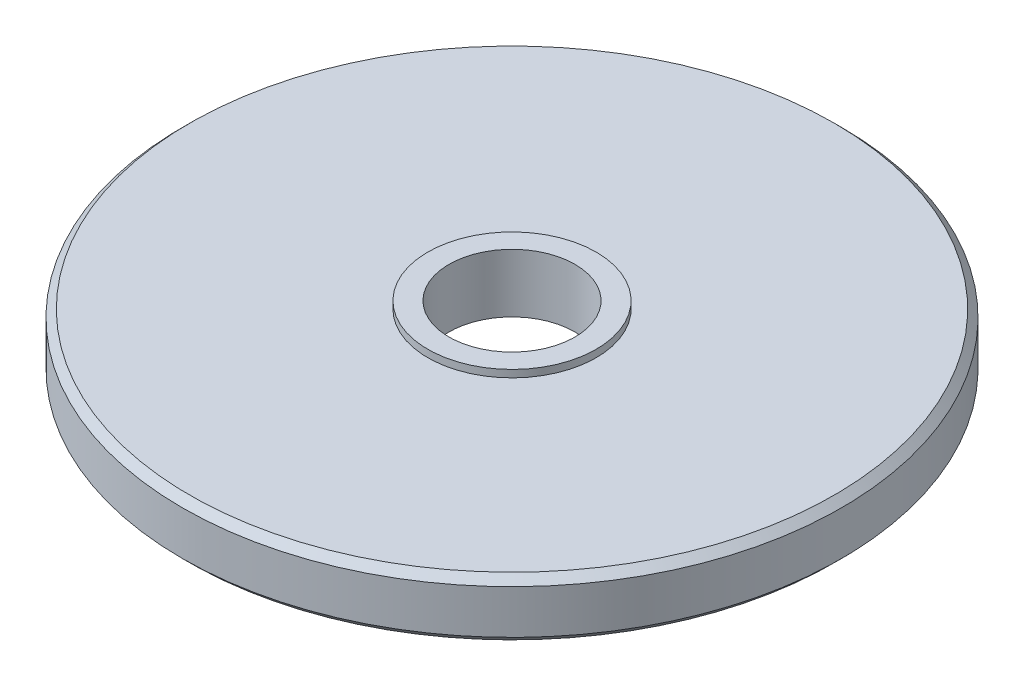
ISO-10303-21;
HEADER;
FILE_DESCRIPTION(('STEP AP214'),'2;1');
FILE_NAME('part.step','',(''),(''),'','','');
FILE_SCHEMA(('AUTOMOTIVE_DESIGN { 1 0 10303 214 1 1 1 1 }'));
ENDSEC;
DATA;
#1=APPLICATION_CONTEXT('core data for automotive mechanical design processes');
#2=APPLICATION_PROTOCOL_DEFINITION('international standard','automotive_design',2000,#1);
#3=PRODUCT_CONTEXT('',#1,'mechanical');
#4=PRODUCT('Part','Part','',(#3));
#5=PRODUCT_RELATED_PRODUCT_CATEGORY('part','',(#4));
#6=PRODUCT_DEFINITION_FORMATION('','',#4);
#7=PRODUCT_DEFINITION_CONTEXT('part definition',#1,'design');
#8=PRODUCT_DEFINITION('design','',#6,#7);
#9=PRODUCT_DEFINITION_SHAPE('','',#8);
#10=(LENGTH_UNIT() NAMED_UNIT(*) SI_UNIT(.MILLI.,.METRE.));
#11=(NAMED_UNIT(*) PLANE_ANGLE_UNIT() SI_UNIT($,.RADIAN.));
#12=(NAMED_UNIT(*) SI_UNIT($,.STERADIAN.) SOLID_ANGLE_UNIT());
#13=UNCERTAINTY_MEASURE_WITH_UNIT(LENGTH_MEASURE(1.E-05),#10,'distance_accuracy_value','');
#14=(GEOMETRIC_REPRESENTATION_CONTEXT(3) GLOBAL_UNCERTAINTY_ASSIGNED_CONTEXT((#13)) GLOBAL_UNIT_ASSIGNED_CONTEXT((#10,
#11,#12)) REPRESENTATION_CONTEXT('',''));
#15=CARTESIAN_POINT('',(0.,0.,0.));
#16=DIRECTION('',(0.,0.,1.));
#17=DIRECTION('',(1.,0.,0.));
#18=AXIS2_PLACEMENT_3D('',#15,#16,#17);
#19=CARTESIAN_POINT('',(0.,0.,0.));
#20=DIRECTION('',(0.,-1.,0.));
#21=DIRECTION('',(0.,0.,-1.));
#22=AXIS2_PLACEMENT_3D('',#19,#20,#21);
#23=CYLINDRICAL_SURFACE('',#22,8.6);
#24=CARTESIAN_POINT('',(0.,29.7093175111616,0.));
#25=DIRECTION('',(0.,-1.,0.));
#26=DIRECTION('',(0.,0.,-1.));
#27=AXIS2_PLACEMENT_3D('',#24,#25,#26);
#28=CIRCLE('',#27,8.6);
#29=CARTESIAN_POINT('',(0.,29.7093175111616,-8.6));
#30=VERTEX_POINT('',#29);
#31=EDGE_CURVE('E10',#30,#30,#28,.T.);
#32=ORIENTED_EDGE('',*,*,#31,.F.);
#33=EDGE_LOOP('',(#32));
#34=FACE_BOUND('',#33,.T.);
#35=CARTESIAN_POINT('',(0.,21.7093175111616,0.));
#36=DIRECTION('',(0.,-1.,0.));
#37=DIRECTION('',(0.,0.,-1.));
#38=AXIS2_PLACEMENT_3D('',#35,#36,#37);
#39=CIRCLE('',#38,8.6);
#40=CARTESIAN_POINT('',(0.,21.7093175111616,-8.6));
#41=VERTEX_POINT('',#40);
#42=EDGE_CURVE('E66',#41,#41,#39,.T.);
#43=ORIENTED_EDGE('',*,*,#42,.T.);
#44=EDGE_LOOP('',(#43));
#45=FACE_BOUND('',#44,.T.);
#46=ADVANCED_FACE('F32',(#34,#45),#23,.F.);
#47=CARTESIAN_POINT('',(-8.6,29.7093175111616,0.));
#48=DIRECTION('',(0.,-1.,0.));
#49=DIRECTION('',(0.,0.,-1.));
#50=AXIS2_PLACEMENT_3D('',#47,#48,#49);
#51=PLANE('',#50);
#52=CARTESIAN_POINT('',(0.,29.7093175111616,0.));
#53=DIRECTION('',(0.,-1.,0.));
#54=DIRECTION('',(0.,0.,-1.));
#55=AXIS2_PLACEMENT_3D('',#52,#53,#54);
#56=CIRCLE('',#55,11.5);
#57=CARTESIAN_POINT('',(0.,29.7093175111616,-11.5));
#58=VERTEX_POINT('',#57);
#59=EDGE_CURVE('E38',#58,#58,#56,.T.);
#60=ORIENTED_EDGE('',*,*,#59,.F.);
#61=EDGE_LOOP('',(#60));
#62=FACE_BOUND('',#61,.T.);
#63=ORIENTED_EDGE('',*,*,#31,.T.);
#64=EDGE_LOOP('',(#63));
#65=FACE_BOUND('',#64,.T.);
#66=ADVANCED_FACE('F115',(#62,#65),#51,.F.);
#67=CARTESIAN_POINT('',(0.,0.,0.));
#68=DIRECTION('',(0.,-1.,0.));
#69=DIRECTION('',(0.,0.,-1.));
#70=AXIS2_PLACEMENT_3D('',#67,#68,#69);
#71=CYLINDRICAL_SURFACE('',#70,11.5);
#72=CARTESIAN_POINT('',(0.,28.7093175111616,0.));
#73=DIRECTION('',(0.,-1.,0.));
#74=DIRECTION('',(0.,0.,-1.));
#75=AXIS2_PLACEMENT_3D('',#72,#73,#74);
#76=CIRCLE('',#75,11.5);
#77=CARTESIAN_POINT('',(0.,28.7093175111616,-11.5));
#78=VERTEX_POINT('',#77);
#79=EDGE_CURVE('E42',#78,#78,#76,.T.);
#80=ORIENTED_EDGE('',*,*,#79,.F.);
#81=EDGE_LOOP('',(#80));
#82=FACE_BOUND('',#81,.T.);
#83=ORIENTED_EDGE('',*,*,#59,.T.);
#84=EDGE_LOOP('',(#83));
#85=FACE_BOUND('',#84,.T.);
#86=ADVANCED_FACE('F110',(#82,#85),#71,.T.);
#87=CARTESIAN_POINT('',(-11.5,28.7093175111616,0.));
#88=DIRECTION('',(0.,-1.,0.));
#89=DIRECTION('',(0.,0.,-1.));
#90=AXIS2_PLACEMENT_3D('',#87,#88,#89);
#91=PLANE('',#90);
#92=CARTESIAN_POINT('',(0.,28.7093175111616,0.));
#93=DIRECTION('',(0.,-1.,0.));
#94=DIRECTION('',(0.,0.,-1.));
#95=AXIS2_PLACEMENT_3D('',#92,#93,#94);
#96=CIRCLE('',#95,44.);
#97=CARTESIAN_POINT('',(0.,28.7093175111616,-44.));
#98=VERTEX_POINT('',#97);
#99=EDGE_CURVE('E46',#98,#98,#96,.T.);
#100=ORIENTED_EDGE('',*,*,#99,.F.);
#101=EDGE_LOOP('',(#100));
#102=FACE_BOUND('',#101,.T.);
#103=ORIENTED_EDGE('',*,*,#79,.T.);
#104=EDGE_LOOP('',(#103));
#105=FACE_BOUND('',#104,.T.);
#106=ADVANCED_FACE('F104',(#102,#105),#91,.F.);
#107=CARTESIAN_POINT('',(0.,28.7093175111616,0.));
#108=DIRECTION('',(0.,-1.,0.));
#109=DIRECTION('',(0.,0.,-1.));
#110=AXIS2_PLACEMENT_3D('',#107,#108,#109);
#111=CONICAL_SURFACE('',#110,44.,0.785398163397448);
#112=CARTESIAN_POINT('',(0.,27.7093175111616,0.));
#113=DIRECTION('',(0.,-1.,0.));
#114=DIRECTION('',(0.,0.,-1.));
#115=AXIS2_PLACEMENT_3D('',#112,#113,#114);
#116=CIRCLE('',#115,45.);
#117=CARTESIAN_POINT('',(0.,27.7093175111616,-45.));
#118=VERTEX_POINT('',#117);
#119=EDGE_CURVE('E51',#118,#118,#116,.T.);
#120=ORIENTED_EDGE('',*,*,#119,.F.);
#121=EDGE_LOOP('',(#120));
#122=FACE_BOUND('',#121,.T.);
#123=ORIENTED_EDGE('',*,*,#99,.T.);
#124=EDGE_LOOP('',(#123));
#125=FACE_BOUND('',#124,.T.);
#126=ADVANCED_FACE('F98',(#122,#125),#111,.T.);
#127=CARTESIAN_POINT('',(0.,0.,0.));
#128=DIRECTION('',(0.,-1.,0.));
#129=DIRECTION('',(0.,0.,-1.));
#130=AXIS2_PLACEMENT_3D('',#127,#128,#129);
#131=CYLINDRICAL_SURFACE('',#130,45.);
#132=CARTESIAN_POINT('',(0.,21.7093175111616,0.));
#133=DIRECTION('',(0.,-1.,0.));
#134=DIRECTION('',(0.,0.,-1.));
#135=AXIS2_PLACEMENT_3D('',#132,#133,#134);
#136=CIRCLE('',#135,45.);
#137=CARTESIAN_POINT('',(0.,21.7093175111616,-45.));
#138=VERTEX_POINT('',#137);
#139=EDGE_CURVE('E54',#138,#138,#136,.T.);
#140=ORIENTED_EDGE('',*,*,#139,.F.);
#141=EDGE_LOOP('',(#140));
#142=FACE_BOUND('',#141,.T.);
#143=ORIENTED_EDGE('',*,*,#119,.T.);
#144=EDGE_LOOP('',(#143));
#145=FACE_BOUND('',#144,.T.);
#146=ADVANCED_FACE('F92',(#142,#145),#131,.T.);
#147=CARTESIAN_POINT('',(0.,21.7093175111616,0.));
#148=DIRECTION('',(0.,1.,0.));
#149=DIRECTION('',(0.,0.,1.));
#150=AXIS2_PLACEMENT_3D('',#147,#148,#149);
#151=CONICAL_SURFACE('',#150,45.,0.785398163397448);
#152=CARTESIAN_POINT('',(0.,20.7093175111616,0.));
#153=DIRECTION('',(0.,-1.,0.));
#154=DIRECTION('',(0.,0.,-1.));
#155=AXIS2_PLACEMENT_3D('',#152,#153,#154);
#156=CIRCLE('',#155,44.);
#157=CARTESIAN_POINT('',(0.,20.7093175111616,-44.));
#158=VERTEX_POINT('',#157);
#159=EDGE_CURVE('E57',#158,#158,#156,.T.);
#160=ORIENTED_EDGE('',*,*,#159,.F.);
#161=EDGE_LOOP('',(#160));
#162=FACE_BOUND('',#161,.T.);
#163=ORIENTED_EDGE('',*,*,#139,.T.);
#164=EDGE_LOOP('',(#163));
#165=FACE_BOUND('',#164,.T.);
#166=ADVANCED_FACE('F86',(#162,#165),#151,.T.);
#167=CARTESIAN_POINT('',(-44.,20.7093175111616,0.));
#168=DIRECTION('',(0.,1.,0.));
#169=DIRECTION('',(0.,0.,1.));
#170=AXIS2_PLACEMENT_3D('',#167,#168,#169);
#171=PLANE('',#170);
#172=CARTESIAN_POINT('',(0.,20.7093175111616,0.));
#173=DIRECTION('',(0.,-1.,0.));
#174=DIRECTION('',(0.,0.,-1.));
#175=AXIS2_PLACEMENT_3D('',#172,#173,#174);
#176=CIRCLE('',#175,11.);
#177=CARTESIAN_POINT('',(0.,20.7093175111616,-11.));
#178=VERTEX_POINT('',#177);
#179=EDGE_CURVE('E60',#178,#178,#176,.T.);
#180=ORIENTED_EDGE('',*,*,#179,.F.);
#181=EDGE_LOOP('',(#180));
#182=FACE_BOUND('',#181,.T.);
#183=ORIENTED_EDGE('',*,*,#159,.T.);
#184=EDGE_LOOP('',(#183));
#185=FACE_BOUND('',#184,.T.);
#186=ADVANCED_FACE('F80',(#182,#185),#171,.F.);
#187=CARTESIAN_POINT('',(0.,0.,0.));
#188=DIRECTION('',(0.,-1.,0.));
#189=DIRECTION('',(0.,0.,-1.));
#190=AXIS2_PLACEMENT_3D('',#187,#188,#189);
#191=CYLINDRICAL_SURFACE('',#190,11.);
#192=CARTESIAN_POINT('',(0.,21.7093175111616,0.));
#193=DIRECTION('',(0.,-1.,0.));
#194=DIRECTION('',(0.,0.,-1.));
#195=AXIS2_PLACEMENT_3D('',#192,#193,#194);
#196=CIRCLE('',#195,11.);
#197=CARTESIAN_POINT('',(0.,21.7093175111616,-11.));
#198=VERTEX_POINT('',#197);
#199=EDGE_CURVE('E63',#198,#198,#196,.T.);
#200=ORIENTED_EDGE('',*,*,#199,.F.);
#201=EDGE_LOOP('',(#200));
#202=FACE_BOUND('',#201,.T.);
#203=ORIENTED_EDGE('',*,*,#179,.T.);
#204=EDGE_LOOP('',(#203));
#205=FACE_BOUND('',#204,.T.);
#206=ADVANCED_FACE('F74',(#202,#205),#191,.F.);
#207=CARTESIAN_POINT('',(-11.,21.7093175111616,0.));
#208=DIRECTION('',(0.,1.,0.));
#209=DIRECTION('',(0.,0.,1.));
#210=AXIS2_PLACEMENT_3D('',#207,#208,#209);
#211=PLANE('',#210);
#212=ORIENTED_EDGE('',*,*,#42,.F.);
#213=EDGE_LOOP('',(#212));
#214=FACE_BOUND('',#213,.T.);
#215=ORIENTED_EDGE('',*,*,#199,.T.);
#216=EDGE_LOOP('',(#215));
#217=FACE_BOUND('',#216,.T.);
#218=ADVANCED_FACE('F71',(#214,#217),#211,.F.);
#219=CLOSED_SHELL('',(#46,#66,#86,#106,#126,#146,#166,#186,#206,#218));
#220=MANIFOLD_SOLID_BREP('B2',#219);
#221=ADVANCED_BREP_SHAPE_REPRESENTATION('',(#18,#220),#14);
#222=SHAPE_DEFINITION_REPRESENTATION(#9,#221);
ENDSEC;
END-ISO-10303-21;
